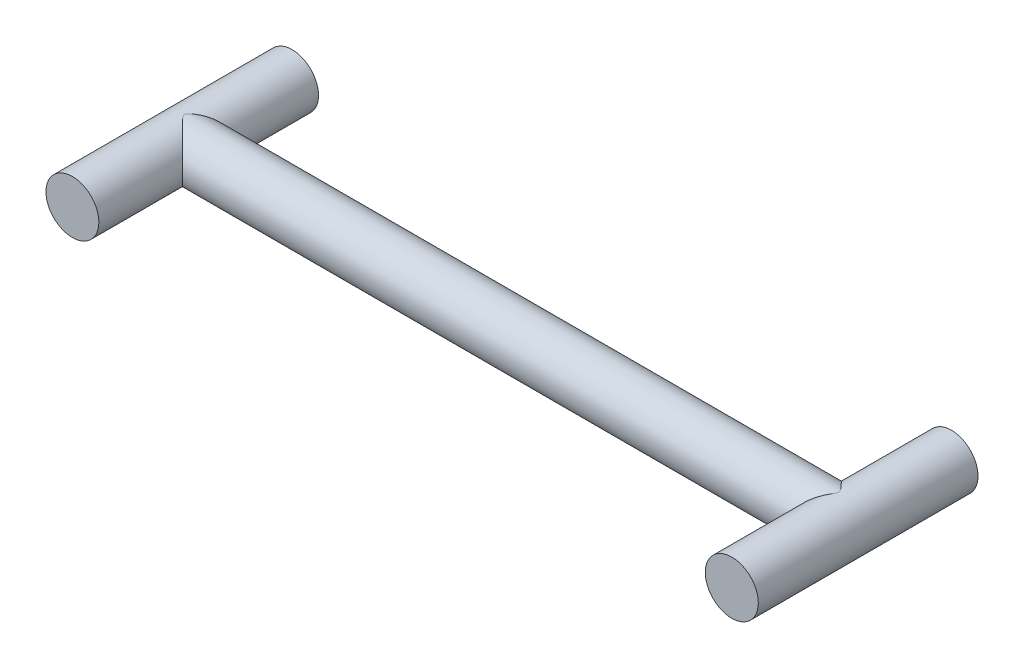
ISO-10303-21;
HEADER;
FILE_DESCRIPTION(('STEP AP214'),'2;1');
FILE_NAME('part.step','',(''),(''),'','','');
FILE_SCHEMA(('AUTOMOTIVE_DESIGN { 1 0 10303 214 1 1 1 1 }'));
ENDSEC;
DATA;
#1=APPLICATION_CONTEXT('core data for automotive mechanical design processes');
#2=APPLICATION_PROTOCOL_DEFINITION('international standard','automotive_design',2000,#1);
#3=PRODUCT_CONTEXT('',#1,'mechanical');
#4=PRODUCT('Part','Part','',(#3));
#5=PRODUCT_RELATED_PRODUCT_CATEGORY('part','',(#4));
#6=PRODUCT_DEFINITION_FORMATION('','',#4);
#7=PRODUCT_DEFINITION_CONTEXT('part definition',#1,'design');
#8=PRODUCT_DEFINITION('design','',#6,#7);
#9=PRODUCT_DEFINITION_SHAPE('','',#8);
#10=(LENGTH_UNIT() NAMED_UNIT(*) SI_UNIT(.MILLI.,.METRE.));
#11=(NAMED_UNIT(*) PLANE_ANGLE_UNIT() SI_UNIT($,.RADIAN.));
#12=(NAMED_UNIT(*) SI_UNIT($,.STERADIAN.) SOLID_ANGLE_UNIT());
#13=UNCERTAINTY_MEASURE_WITH_UNIT(LENGTH_MEASURE(1.E-05),#10,'distance_accuracy_value','');
#14=(GEOMETRIC_REPRESENTATION_CONTEXT(3) GLOBAL_UNCERTAINTY_ASSIGNED_CONTEXT((#13)) GLOBAL_UNIT_ASSIGNED_CONTEXT((#10,
#11,#12)) REPRESENTATION_CONTEXT('',''));
#15=CARTESIAN_POINT('',(0.,0.,0.));
#16=DIRECTION('',(0.,0.,1.));
#17=DIRECTION('',(1.,0.,0.));
#18=AXIS2_PLACEMENT_3D('',#15,#16,#17);
#19=CARTESIAN_POINT('',(15.,0.,0.));
#20=DIRECTION('',(-1.,0.,0.));
#21=DIRECTION('',(0.,0.,1.));
#22=AXIS2_PLACEMENT_3D('',#19,#20,#21);
#23=CYLINDRICAL_SURFACE('',#22,0.6);
#24=CARTESIAN_POINT('',(14.4044117802361,0.,0.6));
#25=CARTESIAN_POINT('',(14.4044138771677,-0.0267869529244519,0.599997901263103));
#26=CARTESIAN_POINT('',(14.4062120963939,-0.0536182281922061,0.598188349645153));
#27=CARTESIAN_POINT('',(14.4132577662871,-0.10638222517906,0.591097096718589));
#28=CARTESIAN_POINT('',(14.4185138946036,-0.132312513053645,0.585806660098265));
#29=CARTESIAN_POINT('',(14.4320164715084,-0.182318851200664,0.572211965447729));
#30=CARTESIAN_POINT('',(14.4402410852341,-0.206406923248302,0.563929713517909));
#31=CARTESIAN_POINT('',(14.4591712194591,-0.252491816672357,0.544858790481551));
#32=CARTESIAN_POINT('',(14.4698767871376,-0.274488598268544,0.534070071710793));
#33=CARTESIAN_POINT('',(14.4980714189654,-0.324761545706948,0.505639207119559));
#34=CARTESIAN_POINT('',(14.5165433177583,-0.351921728822773,0.486999533907745));
#35=CARTESIAN_POINT('',(14.5562908539631,-0.401702701016503,0.446836768729669));
#36=CARTESIAN_POINT('',(14.5775736304444,-0.424311548628157,0.425306332410302));
#37=CARTESIAN_POINT('',(14.6306249521029,-0.47303224307013,0.371507120734918));
#38=CARTESIAN_POINT('',(14.663274348087,-0.497137943723282,0.338296948356237));
#39=CARTESIAN_POINT('',(14.7305475350596,-0.537605300934136,0.269408911628499));
#40=CARTESIAN_POINT('',(14.7651703048471,-0.553970922858098,0.233732321626248));
#41=CARTESIAN_POINT('',(14.8224959018784,-0.575042168362166,0.173103948574968));
#42=CARTESIAN_POINT('',(14.8451286971234,-0.581824014591197,0.148769701342194));
#43=CARTESIAN_POINT('',(14.8822090470378,-0.590709384371346,0.106630215284313));
#44=CARTESIAN_POINT('',(14.8969291501786,-0.593616907265863,0.0892691757697787));
#45=CARTESIAN_POINT('',(14.9143419222993,-0.596484520137757,0.0650992338551544));
#46=CARTESIAN_POINT('',(14.9183048109041,-0.597091430397413,0.0593080244646573));
#47=CARTESIAN_POINT('',(14.9256996470576,-0.598157555059887,0.0473684138206939));
#48=CARTESIAN_POINT('',(14.9291318298737,-0.598616835006739,0.0412201725155951));
#49=CARTESIAN_POINT('',(14.9339336206098,-0.599227752667212,0.0307081333391748));
#50=CARTESIAN_POINT('',(14.9356024921829,-0.599430702090317,0.0264884939514652));
#51=CARTESIAN_POINT('',(14.938287530722,-0.599749909358583,0.0178495463590163));
#52=CARTESIAN_POINT('',(14.9393062153639,-0.599866501882923,0.0134310801385931));
#53=CARTESIAN_POINT('',(14.94048491511,-0.600000915423975,0.00440655178397685));
#54=CARTESIAN_POINT('',(14.9406325810968,-0.600017316056771,-0.000201279802066398));
#55=CARTESIAN_POINT('',(14.9399914220055,-0.599944665920674,-0.00935079168036245));
#56=CARTESIAN_POINT('',(14.9392013153037,-0.599855470837953,-0.0138923728353125));
#57=CARTESIAN_POINT('',(14.936518999167,-0.599541331228656,-0.0241784030979506));
#58=CARTESIAN_POINT('',(14.9343564974842,-0.599282274733914,-0.0298468805008357));
#59=CARTESIAN_POINT('',(14.929273501346,-0.598634072341127,-0.0408385289327078));
#60=CARTESIAN_POINT('',(14.9263485474109,-0.598244157076041,-0.0461594300570705));
#61=CARTESIAN_POINT('',(14.9168107719172,-0.596886793759699,-0.0619725350216555));
#62=CARTESIAN_POINT('',(14.9095443919428,-0.595742222857606,-0.0720431420990267));
#63=CARTESIAN_POINT('',(14.8944013426046,-0.593038541496862,-0.0916647917257681));
#64=CARTESIAN_POINT('',(14.8865228529075,-0.591478158214718,-0.10121412863171));
#65=CARTESIAN_POINT('',(14.8624511611103,-0.586180684539765,-0.129466736733267));
#66=CARTESIAN_POINT('',(14.8458626254335,-0.581832473887628,-0.147719996349821));
#67=CARTESIAN_POINT('',(14.7960121205245,-0.566365159802654,-0.201546771696467));
#68=CARTESIAN_POINT('',(14.7625825333598,-0.552813784279909,-0.236283476100139));
#69=CARTESIAN_POINT('',(14.6971983687312,-0.518857147482543,-0.303643789958164));
#70=CARTESIAN_POINT('',(14.6652407086645,-0.498467027120614,-0.336271879181443));
#71=CARTESIAN_POINT('',(14.6109456552456,-0.455706468244358,-0.391485904562562));
#72=CARTESIAN_POINT('',(14.5880631392271,-0.434817549528832,-0.414677987088154));
#73=CARTESIAN_POINT('',(14.544744243996,-0.388308254988935,-0.458513810137267));
#74=CARTESIAN_POINT('',(14.5243055001617,-0.362692514957153,-0.47916001469723));
#75=CARTESIAN_POINT('',(14.4911419274278,-0.312889489242033,-0.512629094905721));
#76=CARTESIAN_POINT('',(14.4777133090602,-0.289657612255417,-0.526169842708515));
#77=CARTESIAN_POINT('',(14.4536630892918,-0.240414485019034,-0.550409731077724));
#78=CARTESIAN_POINT('',(14.443037772208,-0.214406978688917,-0.561112633209323));
#79=CARTESIAN_POINT('',(14.4267227721825,-0.164387541185026,-0.577542431410931));
#80=CARTESIAN_POINT('',(14.420516700253,-0.140716785600117,-0.583790176615573));
#81=CARTESIAN_POINT('',(14.4109870070323,-0.0922291616927286,-0.593382787385633));
#82=CARTESIAN_POINT('',(14.4076617127123,-0.067412967423483,-0.596729337838035));
#83=CARTESIAN_POINT('',(14.4041337317549,-0.017257050603964,-0.600279848531962));
#84=CARTESIAN_POINT('',(14.4039403182727,0.00808400429247785,-0.600474476276708));
#85=CARTESIAN_POINT('',(14.4067154582712,0.0584133723828288,-0.597681648352057));
#86=CARTESIAN_POINT('',(14.4096844033,0.0834016415082788,-0.59469379864337));
#87=CARTESIAN_POINT('',(14.418363024875,0.131218896331405,-0.585958195219404));
#88=CARTESIAN_POINT('',(14.4239473162473,0.154094523307957,-0.580336700239064));
#89=CARTESIAN_POINT('',(14.4374636774123,0.198391374464734,-0.566726372438121));
#90=CARTESIAN_POINT('',(14.4453967461759,0.219811975024537,-0.558736532322553));
#91=CARTESIAN_POINT('',(14.4667488129209,0.269013447175633,-0.537222992353975));
#92=CARTESIAN_POINT('',(14.4810981434052,0.295980182349987,-0.522758889914831));
#93=CARTESIAN_POINT('',(14.5126641115048,0.34625862786026,-0.490912321141554));
#94=CARTESIAN_POINT('',(14.529886101484,0.369563354689944,-0.473524406636631));
#95=CARTESIAN_POINT('',(14.5732401862076,0.420570550154108,-0.429692476913695));
#96=CARTESIAN_POINT('',(14.6002963222035,0.446659988831081,-0.402293030158795));
#97=CARTESIAN_POINT('',(14.6568942370563,0.492427328377549,-0.344777937815131));
#98=CARTESIAN_POINT('',(14.6864419698361,0.512089290712479,-0.314655772924006));
#99=CARTESIAN_POINT('',(14.7322494376033,0.537349660685653,-0.26755535853646));
#100=CARTESIAN_POINT('',(14.7480351674344,0.545154185935995,-0.25125466643808));
#101=CARTESIAN_POINT('',(14.7798157745968,0.559214316250628,-0.218181390900313));
#102=CARTESIAN_POINT('',(14.7958107192509,0.565469409139167,-0.201408653457871));
#103=CARTESIAN_POINT('',(14.8277089367512,0.576443113019971,-0.167421666603654));
#104=CARTESIAN_POINT('',(14.8436123043754,0.581168330466909,-0.150209671464506));
#105=CARTESIAN_POINT('',(14.8749606050028,0.589142452086541,-0.115068807382047));
#106=CARTESIAN_POINT('',(14.8904055786703,0.592391487579687,-0.0971400023602496));
#107=CARTESIAN_POINT('',(14.9139571942064,0.596477516901344,-0.0660680188997264));
#108=CARTESIAN_POINT('',(14.92269363219,0.597761943582824,-0.0535476737081827));
#109=CARTESIAN_POINT('',(14.9317243397655,0.598951213871874,-0.0357098288250623));
#110=CARTESIAN_POINT('',(14.9337050674764,0.59919870207902,-0.0313249701051088));
#111=CARTESIAN_POINT('',(14.9370233343994,0.599601829971245,-0.0223153536433277));
#112=CARTESIAN_POINT('',(14.9383627333892,0.59975773553712,-0.0176913331866538));
#113=CARTESIAN_POINT('',(14.9399802508075,0.599943858572731,-0.00908154482206608));
#114=CARTESIAN_POINT('',(14.9404023528242,0.599991210261543,-0.00512450999501238));
#115=CARTESIAN_POINT('',(14.9405379666169,0.600006533480072,0.00279748416629695));
#116=CARTESIAN_POINT('',(14.9402523742541,0.599974605368956,0.00676242713959624));
#117=CARTESIAN_POINT('',(14.9388689649362,0.599816333466664,0.0156627842639453));
#118=CARTESIAN_POINT('',(14.9375692794466,0.599666427645186,0.0205650356613442));
#119=CARTESIAN_POINT('',(14.9342224804367,0.599262883679576,0.0301154077091647));
#120=CARTESIAN_POINT('',(14.9321711060703,0.599008653180526,0.0347619024384002));
#121=CARTESIAN_POINT('',(14.9226686062393,0.597762247978874,0.0537996276730146));
#122=CARTESIAN_POINT('',(14.9132712476894,0.59637755116749,0.0671267679449113));
#123=CARTESIAN_POINT('',(14.8934848541211,0.592902204734707,0.0929157378826827));
#124=CARTESIAN_POINT('',(14.8830883539619,0.590805887725876,0.105369620781714));
#125=CARTESIAN_POINT('',(14.8534098342165,0.583951950691666,0.139674718775823));
#126=CARTESIAN_POINT('',(14.8337032730487,0.578409640968841,0.161032422022244));
#127=CARTESIAN_POINT('',(14.7942851595771,0.565030812568009,0.203033393708289));
#128=CARTESIAN_POINT('',(14.7745736427206,0.557190924777519,0.22367556284165));
#129=CARTESIAN_POINT('',(14.7355639013175,0.539169696934768,0.264170099454596));
#130=CARTESIAN_POINT('',(14.7162643851033,0.528997420472808,0.284025184031598));
#131=CARTESIAN_POINT('',(14.6783198091199,0.50620413660324,0.322899636186412));
#132=CARTESIAN_POINT('',(14.6596741870673,0.49358529715401,0.341919725506705));
#133=CARTESIAN_POINT('',(14.6175553763427,0.461383383765697,0.384777220365034));
#134=CARTESIAN_POINT('',(14.5944112252886,0.44085862467691,0.408245216796597));
#135=CARTESIAN_POINT('',(14.5505074650161,0.395080066557858,0.452688294785397));
#136=CARTESIAN_POINT('',(14.5297451912015,0.36983163676571,0.473666162969041));
#137=CARTESIAN_POINT('',(14.495760579601,0.320416296031999,0.507970233044476));
#138=CARTESIAN_POINT('',(14.4818762137623,0.297179163000922,0.521972509731816));
#139=CARTESIAN_POINT('',(14.4569144470823,0.247808421480012,0.547133910524478));
#140=CARTESIAN_POINT('',(14.4458344850782,0.221677487384082,0.558295628862642));
#141=CARTESIAN_POINT('',(14.4288165610992,0.171616615353965,0.575434289601568));
#142=CARTESIAN_POINT('',(14.4223248469223,0.148066833402161,0.581969891424012));
#143=CARTESIAN_POINT('',(14.4122067901407,0.0997849739439403,0.592155101428775));
#144=CARTESIAN_POINT('',(14.4085731023323,0.0750561015631969,0.595812107697146));
#145=CARTESIAN_POINT('',(14.4058011475656,0.0417860583224632,0.598601786747473));
#146=CARTESIAN_POINT('',(14.4052809915848,0.0334478103214853,0.599125259347628));
#147=CARTESIAN_POINT('',(14.4045859482129,0.016741155159681,0.599824726167867));
#148=CARTESIAN_POINT('',(14.4044111248024,0.00837274269788234,0.600000655997868));
#149=CARTESIAN_POINT('',(14.4044117802361,0.,0.6));
#150=B_SPLINE_CURVE_WITH_KNOTS('',3,(#24,#25,#26,#27,#28,#29,#30,#31,#32,#33,#34,#35,#36,#37,
#38,#39,#40,#41,#42,#43,#44,#45,#46,#47,#48,#49,#50,#51,#52,#53,#54,#55,#56,#57,#58,#59,#60,#61,
#62,#63,#64,#65,#66,#67,#68,#69,#70,#71,#72,#73,#74,#75,#76,#77,#78,#79,#80,#81,#82,#83,#84,#85,
#86,#87,#88,#89,#90,#91,#92,#93,#94,#95,#96,#97,#98,#99,#100,#101,#102,#103,#104,#105,#106,#107,
#108,#109,#110,#111,#112,#113,#114,#115,#116,#117,#118,#119,#120,#121,#122,#123,#124,#125,#126,
#127,#128,#129,#130,#131,#132,#133,#134,#135,#136,#137,#138,#139,#140,#141,#142,#143,#144,#145,
#146,#147,#148,#149),.UNSPECIFIED.,.T.,.F.,(4,2,2,2,2,2,2,2,2,2,2,2,2,2,2,2,2,2,2,2,2,2,2,2,2,2,
2,2,2,2,2,2,2,2,2,2,2,2,2,2,2,2,2,2,2,2,2,2,2,2,2,2,2,2,2,2,2,2,2,2,2,2,4),(0.,
0.0803222801691046,0.160846902573798,0.240790905201445,0.32073642820843,0.433411090542751,
0.546377634240589,0.702865566285271,0.859273239978592,0.960929052819867,1.02959250489933,
1.05070930038946,1.07181670757834,1.08540811315146,1.09894656511956,1.11267650960222,
1.12642523998317,1.14453970349753,1.16276259083776,1.20007439281129,1.23750174692048,
1.31256090534336,1.46230109359445,1.61171192327367,1.72745581388977,1.84308678716593,
1.93293079395927,2.02265511032464,2.09809930955511,2.17349966468712,2.24912323130281,
2.32475616235899,2.39708530971781,2.46944526406473,2.57027947446217,2.67130370273844,
2.81009559080984,2.94922908240638,3.02117070215519,3.09313607107203,3.16478639369225,
3.23643034108489,3.28208883195398,3.29650924020001,3.31088757382578,3.3227671581742,
3.33463171199476,3.34976091423213,3.36497723549844,3.41368861519778,3.46279740942595,
3.55138310178425,3.64009934962428,3.72847652259249,3.81677573742018,3.93288421765554,
4.04886151439656,4.13996076345685,4.23097651213285,4.30653128266278,4.3818912350987,
4.40699275457477,4.43209892423355),.UNSPECIFIED.);
#151=CARTESIAN_POINT('',(14.4044117802361,0.,0.6));
#152=VERTEX_POINT('',#151);
#153=EDGE_CURVE('E43',#152,#152,#150,.T.);
#154=ORIENTED_EDGE('',*,*,#153,.F.);
#155=EDGE_LOOP('',(#154));
#156=FACE_BOUND('',#155,.T.);
#157=CARTESIAN_POINT('',(0.602112422880623,0.,0.6));
#158=CARTESIAN_POINT('',(0.602108227329578,0.0267500440066616,0.599995801496043));
#159=CARTESIAN_POINT('',(0.600311256231344,0.0535469409428353,0.598192550989909));
#160=CARTESIAN_POINT('',(0.593263794618739,0.106253257287472,0.591119822958435));
#161=CARTESIAN_POINT('',(0.58800312712855,0.132159824000218,0.585840131007082));
#162=CARTESIAN_POINT('',(0.574489305986293,0.182115308729485,0.572275225062206));
#163=CARTESIAN_POINT('',(0.566258515472655,0.206176521397741,0.564012471413674));
#164=CARTESIAN_POINT('',(0.547313487639444,0.252206367597728,0.544989389239753));
#165=CARTESIAN_POINT('',(0.536599467945087,0.274175184264933,0.534229279577511));
#166=CARTESIAN_POINT('',(0.508379903964304,0.324382381231514,0.50587869572989));
#167=CARTESIAN_POINT('',(0.48988957614286,0.351505911597435,0.487295262057261));
#168=CARTESIAN_POINT('',(0.45009183445887,0.401217441060633,0.447267509913797));
#169=CARTESIAN_POINT('',(0.428777339996823,0.423793668546067,0.425815999487354));
#170=CARTESIAN_POINT('',(0.375600620272691,0.472459841789907,0.372223439178674));
#171=CARTESIAN_POINT('',(0.342843253960256,0.496541117267249,0.339152921835045));
#172=CARTESIAN_POINT('',(0.275232798872467,0.536967215337399,0.27065075540754));
#173=CARTESIAN_POINT('',(0.240380137393653,0.553313609324468,0.235219587576029));
#174=CARTESIAN_POINT('',(0.18267644950492,0.574232862403717,0.175673572445258));
#175=CARTESIAN_POINT('',(0.160021527953717,0.580925701326345,0.152076499865581));
#176=CARTESIAN_POINT('',(0.121615219557304,0.589923921462632,0.110904586575421));
#177=CARTESIAN_POINT('',(0.105777789704037,0.592939640603437,0.0935809536249698));
#178=CARTESIAN_POINT('',(0.0846118330533912,0.59617149211164,0.0680768461630988));
#179=CARTESIAN_POINT('',(0.0785966129525836,0.596989557784856,0.0605330247764549));
#180=CARTESIAN_POINT('',(0.0672539795028314,0.598370262000744,0.0448941710198929));
#181=CARTESIAN_POINT('',(0.0619239364465005,0.598933899331076,0.0368014400509432));
#182=CARTESIAN_POINT('',(0.0560389504094133,0.599501611707589,0.0246857785190977));
#183=CARTESIAN_POINT('',(0.0545428898135645,0.599638143489124,0.0211520918677456));
#184=CARTESIAN_POINT('',(0.0521603346146688,0.599850040343388,0.0138921386421195));
#185=CARTESIAN_POINT('',(0.0512701360972898,0.599925777601551,0.0101671947478159));
#186=CARTESIAN_POINT('',(0.0504158552149373,0.599998151188623,0.00336607130743532));
#187=CARTESIAN_POINT('',(0.0503017429509467,0.600007613711775,0.000309751165196454));
#188=CARTESIAN_POINT('',(0.0506306005035572,0.599979946465349,-0.0057737664240182));
#189=CARTESIAN_POINT('',(0.051074178227446,0.599942765852743,-0.0088009284605804));
#190=CARTESIAN_POINT('',(0.0526951821475424,0.599802799091604,-0.0159387438926527));
#191=CARTESIAN_POINT('',(0.0540958886912182,0.599679652105722,-0.019995912491133));
#192=CARTESIAN_POINT('',(0.057476482095726,0.599365421383195,-0.0278675522433906));
#193=CARTESIAN_POINT('',(0.0594597618179489,0.599173938216623,-0.0316804376132276));
#194=CARTESIAN_POINT('',(0.0698805223775652,0.598098633470963,-0.0499312898843602));
#195=CARTESIAN_POINT('',(0.0803495237323133,0.596817924248983,-0.0631013363146917));
#196=CARTESIAN_POINT('',(0.101926134263795,0.593532109654066,-0.0887759485145063));
#197=CARTESIAN_POINT('',(0.113037564487641,0.591522190813133,-0.101275443511773));
#198=CARTESIAN_POINT('',(0.144654437224152,0.584841686453032,-0.135950263848981));
#199=CARTESIAN_POINT('',(0.165456768245635,0.579336202343829,-0.157735008965138));
#200=CARTESIAN_POINT('',(0.206896281516864,0.565875876559825,-0.200719009628152));
#201=CARTESIAN_POINT('',(0.227533194244347,0.557917643390199,-0.221917409911108));
#202=CARTESIAN_POINT('',(0.268303540648265,0.539489951780209,-0.26356850125467));
#203=CARTESIAN_POINT('',(0.288438406477397,0.52902883501653,-0.284023414732575));
#204=CARTESIAN_POINT('',(0.327963975563786,0.505478576660837,-0.324083829751853));
#205=CARTESIAN_POINT('',(0.347355331699839,0.492391806677367,-0.343690078554664));
#206=CARTESIAN_POINT('',(0.389848808760947,0.459828212038607,-0.386592806192124));
#207=CARTESIAN_POINT('',(0.41266862706551,0.439571747834331,-0.409588459986496));
#208=CARTESIAN_POINT('',(0.455966639328331,0.394472770994423,-0.453180191380991));
#209=CARTESIAN_POINT('',(0.476447414302621,0.369635393903154,-0.473778914356537));
#210=CARTESIAN_POINT('',(0.510299653278758,0.320677061779706,-0.507807780950982));
#211=CARTESIAN_POINT('',(0.524274193277958,0.297402505631997,-0.521848131299452));
#212=CARTESIAN_POINT('',(0.549389243296314,0.247945375060254,-0.547074548683671));
#213=CARTESIAN_POINT('',(0.560533365585699,0.221766569101077,-0.558264253860696));
#214=CARTESIAN_POINT('',(0.577643906042204,0.171595997770796,-0.575442076635085));
#215=CARTESIAN_POINT('',(0.584168328226544,0.147988324317374,-0.581990940243529));
#216=CARTESIAN_POINT('',(0.594339212668552,0.0995545142178583,-0.592199225278018));
#217=CARTESIAN_POINT('',(0.597987490552033,0.0747291567920793,-0.595860469574349));
#218=CARTESIAN_POINT('',(0.602145038674078,0.0244645760484018,-0.600032756663416));
#219=CARTESIAN_POINT('',(0.602643793697298,-0.000976419255995374,-0.600533246743506));
#220=CARTESIAN_POINT('',(0.600433815673248,-0.0515758882835879,-0.598315473913532));
#221=CARTESIAN_POINT('',(0.597724786468547,-0.0767343357041658,-0.595596913805912));
#222=CARTESIAN_POINT('',(0.589522484090572,-0.124767240423469,-0.587364878937563));
#223=CARTESIAN_POINT('',(0.58417592059287,-0.147692944692656,-0.581998673971855));
#224=CARTESIAN_POINT('',(0.571106735790941,-0.192129749845854,-0.568879485082752));
#225=CARTESIAN_POINT('',(0.56338319514279,-0.213640299476246,-0.561125577666537));
#226=CARTESIAN_POINT('',(0.542613544779295,-0.26280581998554,-0.540269620363195));
#227=CARTESIAN_POINT('',(0.52866006418094,-0.289690927646793,-0.52625486699902));
#228=CARTESIAN_POINT('',(0.497872149050501,-0.339903472328394,-0.495317894785455));
#229=CARTESIAN_POINT('',(0.481031964936628,-0.363223630037174,-0.478389873171925));
#230=CARTESIAN_POINT('',(0.43858160938638,-0.41432207169764,-0.43568436570884));
#231=CARTESIAN_POINT('',(0.412040278976454,-0.440528679655912,-0.408958307538707));
#232=CARTESIAN_POINT('',(0.356417702312491,-0.486633556271724,-0.352862014594743));
#233=CARTESIAN_POINT('',(0.327332431983435,-0.506521591174688,-0.323487588212505));
#234=CARTESIAN_POINT('',(0.267485589878367,-0.540545328541847,-0.262729828116804));
#235=CARTESIAN_POINT('',(0.236713387959795,-0.554638253533854,-0.231333466561113));
#236=CARTESIAN_POINT('',(0.174483146018886,-0.577207572411399,-0.167320480084719));
#237=CARTESIAN_POINT('',(0.143026614663313,-0.585695238474591,-0.134706444399331));
#238=CARTESIAN_POINT('',(0.100165235087289,-0.593858435011616,-0.0867945540386125));
#239=CARTESIAN_POINT('',(0.0878734974091078,-0.595779020327163,-0.0726251409359725));
#240=CARTESIAN_POINT('',(0.0697180687466384,-0.598099807721741,-0.0485730860307886));
#241=CARTESIAN_POINT('',(0.0632548251268848,-0.598800841929801,-0.0392531426158337));
#242=CARTESIAN_POINT('',(0.0566407741917186,-0.599444851869909,-0.025991752334436));
#243=CARTESIAN_POINT('',(0.0552010268844568,-0.59957796659672,-0.0227460476641237));
#244=CARTESIAN_POINT('',(0.0528040701320004,-0.599793693372831,-0.0160820503470792));
#245=CARTESIAN_POINT('',(0.0518452606963015,-0.599876473075106,-0.0126643721496096));
#246=CARTESIAN_POINT('',(0.0507009933091643,-0.599974242658186,-0.00627239193553922));
#247=CARTESIAN_POINT('',(0.0504145656982324,-0.59999811726407,-0.00331719211922436));
#248=CARTESIAN_POINT('',(0.0503723611463149,-0.600001665071813,0.00259441916520922));
#249=CARTESIAN_POINT('',(0.0506160933703172,-0.599981379158553,0.00555082698113141));
#250=CARTESIAN_POINT('',(0.0517229691507965,-0.599887027002677,0.0122415219090921));
#251=CARTESIAN_POINT('',(0.0527477792493932,-0.599798847670081,0.0159476948634466));
#252=CARTESIAN_POINT('',(0.0553596111671935,-0.599563597451243,0.0231640121826025));
#253=CARTESIAN_POINT('',(0.0569499009438027,-0.599416183585405,0.0266728768124632));
#254=CARTESIAN_POINT('',(0.064522813070139,-0.598672229269641,0.0415250225408291));
#255=CARTESIAN_POINT('',(0.0720788755717088,-0.597831661567812,0.0519966317334025));
#256=CARTESIAN_POINT('',(0.0879383371561445,-0.595714336059223,0.0722929942844643));
#257=CARTESIAN_POINT('',(0.0962470203277733,-0.594434284448762,0.0821121746598094));
#258=CARTESIAN_POINT('',(0.12151221091354,-0.589966585012182,0.110994594430246));
#259=CARTESIAN_POINT('',(0.138904269998718,-0.586143589015832,0.129608609093614));
#260=CARTESIAN_POINT('',(0.173747177903657,-0.576786575107744,0.166353253606744));
#261=CARTESIAN_POINT('',(0.191198073927198,-0.571250317703855,0.184483216835245));
#262=CARTESIAN_POINT('',(0.225897129283203,-0.558435071422118,0.220252400871276));
#263=CARTESIAN_POINT('',(0.243145641193554,-0.551159818602756,0.237892584454191));
#264=CARTESIAN_POINT('',(0.277267325377129,-0.534808791906333,0.272668065881024));
#265=CARTESIAN_POINT('',(0.294140659718825,-0.525733812963183,0.28980358281055));
#266=CARTESIAN_POINT('',(0.344346556188169,-0.495484152037326,0.340686523664052));
#267=CARTESIAN_POINT('',(0.376908536076255,-0.471410801327204,0.373546238754245));
#268=CARTESIAN_POINT('',(0.438279675482519,-0.414944494776364,0.435387844059929));
#269=CARTESIAN_POINT('',(0.467100956052689,-0.382579474764138,0.464382267777232));
#270=CARTESIAN_POINT('',(0.507647090428428,-0.324802076624085,0.505142100204525));
#271=CARTESIAN_POINT('',(0.521427252733611,-0.302294149668625,0.51898788387237));
#272=CARTESIAN_POINT('',(0.546359959011056,-0.254471466170301,0.544032365189735));
#273=CARTESIAN_POINT('',(0.557512701239935,-0.229156921617834,0.555231262564935));
#274=CARTESIAN_POINT('',(0.576584699388705,-0.175788343315191,0.574379039765319));
#275=CARTESIAN_POINT('',(0.584465348386555,-0.14770618613042,0.582289116722952));
#276=CARTESIAN_POINT('',(0.596081720153081,-0.0899199005307161,0.59394806248366));
#277=CARTESIAN_POINT('',(0.599833604771179,-0.0602225774833646,0.597713156646044));
#278=CARTESIAN_POINT('',(0.601858452753953,-0.020255320185183,0.599745131842092));
#279=CARTESIAN_POINT('',(0.602114011857924,-0.0101310202848211,0.600001590095655));
#280=CARTESIAN_POINT('',(0.602112422880623,0.,0.6));
#281=B_SPLINE_CURVE_WITH_KNOTS('',3,(#157,#158,#159,#160,#161,#162,#163,#164,#165,#166,#167,
#168,#169,#170,#171,#172,#173,#174,#175,#176,#177,#178,#179,#180,#181,#182,#183,#184,#185,#186,
#187,#188,#189,#190,#191,#192,#193,#194,#195,#196,#197,#198,#199,#200,#201,#202,#203,#204,#205,
#206,#207,#208,#209,#210,#211,#212,#213,#214,#215,#216,#217,#218,#219,#220,#221,#222,#223,#224,
#225,#226,#227,#228,#229,#230,#231,#232,#233,#234,#235,#236,#237,#238,#239,#240,#241,#242,#243,
#244,#245,#246,#247,#248,#249,#250,#251,#252,#253,#254,#255,#256,#257,#258,#259,#260,#261,#262,
#263,#264,#265,#266,#267,#268,#269,#270,#271,#272,#273,#274,#275,#276,#277,#278,#279,#280),
.UNSPECIFIED.,.T.,.F.,(4,2,2,2,2,2,2,2,2,2,2,2,2,2,2,2,2,2,2,2,2,2,2,2,2,2,2,2,2,2,2,2,2,2,2,2,
2,2,2,2,2,2,2,2,2,2,2,2,2,2,2,2,2,2,2,2,2,2,2,2,2,4),(0.,0.0802160954372972,0.160668938599059,
0.240528247546693,0.320380560429549,0.432920675364611,0.545748481168865,0.702137531926234,
0.858494797519364,0.95856597282269,1.02944581666035,1.05850178561358,1.08744267836352,
1.098928430638,1.11034331882231,1.11946691743908,1.12860046981866,1.14140467396848,
1.15428497952791,1.20453418526175,1.25512130445185,1.34681318141642,1.43863241685408,
1.53014979606245,1.62158488180019,1.73584867208992,1.84998513431851,1.94134155130404,
2.03258078369774,2.10831857334177,2.18400851356337,2.25995102444423,2.33590054723457,
2.40803457689757,2.48019654099032,2.57977028847853,2.67954471633329,2.81645814731101,
2.95359221019226,3.09172112379144,3.22957140730964,3.28614187320732,3.32000172407528,
3.33063617299262,3.34123500446169,3.35009728651681,3.35895136714581,3.37042021299995,
3.38195644531749,3.42047545555319,3.45928969505419,3.53644254702725,3.61369667851959,
3.69078630581714,3.76784195838026,3.92351143597331,4.07866318413096,4.16777446940191,
4.25687902846846,4.34700693365331,4.43678076850031,4.4671609387102),.UNSPECIFIED.);
#282=CARTESIAN_POINT('',(0.602112422880623,0.,0.6));
#283=VERTEX_POINT('',#282);
#284=EDGE_CURVE('E10',#283,#283,#281,.T.);
#285=ORIENTED_EDGE('',*,*,#284,.F.);
#286=EDGE_LOOP('',(#285));
#287=FACE_BOUND('',#286,.T.);
#288=ADVANCED_FACE('F33',(#156,#287),#23,.T.);
#289=CARTESIAN_POINT('',(15.0082240302076,0.,2.5));
#290=DIRECTION('',(0.,0.,-1.));
#291=DIRECTION('',(-1.,0.,0.));
#292=AXIS2_PLACEMENT_3D('',#289,#290,#291);
#293=CYLINDRICAL_SURFACE('',#292,0.603812249971577);
#294=CARTESIAN_POINT('',(15.0082240302076,0.,-2.5));
#295=DIRECTION('',(0.,0.,1.));
#296=DIRECTION('',(1.,0.,0.));
#297=AXIS2_PLACEMENT_3D('',#294,#295,#296);
#298=CIRCLE('',#297,0.603812249971577);
#299=CARTESIAN_POINT('',(15.6120362801792,0.,-2.5));
#300=VERTEX_POINT('',#299);
#301=EDGE_CURVE('E51',#300,#300,#298,.T.);
#302=ORIENTED_EDGE('',*,*,#301,.T.);
#303=EDGE_LOOP('',(#302));
#304=FACE_BOUND('',#303,.T.);
#305=CARTESIAN_POINT('',(15.0082240302076,0.,2.5));
#306=DIRECTION('',(0.,0.,1.));
#307=DIRECTION('',(1.,0.,0.));
#308=AXIS2_PLACEMENT_3D('',#305,#306,#307);
#309=CIRCLE('',#308,0.603812249971577);
#310=CARTESIAN_POINT('',(15.6120362801792,0.,2.5));
#311=VERTEX_POINT('',#310);
#312=EDGE_CURVE('E47',#311,#311,#309,.T.);
#313=ORIENTED_EDGE('',*,*,#312,.F.);
#314=EDGE_LOOP('',(#313));
#315=FACE_BOUND('',#314,.T.);
#316=ORIENTED_EDGE('',*,*,#153,.T.);
#317=EDGE_LOOP('',(#316));
#318=FACE_BOUND('',#317,.T.);
#319=ADVANCED_FACE('F56',(#304,#315,#318),#293,.T.);
#320=CARTESIAN_POINT('',(15.0082240302076,0.,2.5));
#321=DIRECTION('',(0.,0.,1.));
#322=DIRECTION('',(1.,0.,0.));
#323=AXIS2_PLACEMENT_3D('',#320,#321,#322);
#324=PLANE('',#323);
#325=ORIENTED_EDGE('',*,*,#312,.T.);
#326=EDGE_LOOP('',(#325));
#327=FACE_BOUND('',#326,.T.);
#328=ADVANCED_FACE('F60',(#327),#324,.T.);
#329=CARTESIAN_POINT('',(15.0082240302076,0.,-2.5));
#330=DIRECTION('',(0.,0.,1.));
#331=DIRECTION('',(1.,0.,0.));
#332=AXIS2_PLACEMENT_3D('',#329,#330,#331);
#333=PLANE('',#332);
#334=ORIENTED_EDGE('',*,*,#301,.F.);
#335=EDGE_LOOP('',(#334));
#336=FACE_BOUND('',#335,.T.);
#337=ADVANCED_FACE('F62',(#336),#333,.F.);
#338=CARTESIAN_POINT('',(0.,0.,2.5));
#339=DIRECTION('',(0.,0.,-1.));
#340=DIRECTION('',(-1.,0.,0.));
#341=AXIS2_PLACEMENT_3D('',#338,#339,#340);
#342=CYLINDRICAL_SURFACE('',#341,0.602112422880623);
#343=CARTESIAN_POINT('',(0.,0.,-2.5));
#344=DIRECTION('',(0.,0.,1.));
#345=DIRECTION('',(1.,0.,0.));
#346=AXIS2_PLACEMENT_3D('',#343,#344,#345);
#347=CIRCLE('',#346,0.602112422880623);
#348=CARTESIAN_POINT('',(0.602112422880623,0.,-2.5));
#349=VERTEX_POINT('',#348);
#350=EDGE_CURVE('E129',#349,#349,#347,.T.);
#351=ORIENTED_EDGE('',*,*,#350,.T.);
#352=EDGE_LOOP('',(#351));
#353=FACE_BOUND('',#352,.T.);
#354=CARTESIAN_POINT('',(0.,0.,2.5));
#355=DIRECTION('',(0.,0.,1.));
#356=DIRECTION('',(1.,0.,0.));
#357=AXIS2_PLACEMENT_3D('',#354,#355,#356);
#358=CIRCLE('',#357,0.602112422880623);
#359=CARTESIAN_POINT('',(0.602112422880623,0.,2.5));
#360=VERTEX_POINT('',#359);
#361=EDGE_CURVE('E127',#360,#360,#358,.T.);
#362=ORIENTED_EDGE('',*,*,#361,.F.);
#363=EDGE_LOOP('',(#362));
#364=FACE_BOUND('',#363,.T.);
#365=ORIENTED_EDGE('',*,*,#284,.T.);
#366=EDGE_LOOP('',(#365));
#367=FACE_BOUND('',#366,.T.);
#368=ADVANCED_FACE('F65',(#353,#364,#367),#342,.T.);
#369=CARTESIAN_POINT('',(0.,0.,2.5));
#370=DIRECTION('',(0.,0.,1.));
#371=DIRECTION('',(1.,0.,0.));
#372=AXIS2_PLACEMENT_3D('',#369,#370,#371);
#373=PLANE('',#372);
#374=ORIENTED_EDGE('',*,*,#361,.T.);
#375=EDGE_LOOP('',(#374));
#376=FACE_BOUND('',#375,.T.);
#377=ADVANCED_FACE('F72',(#376),#373,.T.);
#378=CARTESIAN_POINT('',(0.,0.,-2.5));
#379=DIRECTION('',(0.,0.,1.));
#380=DIRECTION('',(1.,0.,0.));
#381=AXIS2_PLACEMENT_3D('',#378,#379,#380);
#382=PLANE('',#381);
#383=ORIENTED_EDGE('',*,*,#350,.F.);
#384=EDGE_LOOP('',(#383));
#385=FACE_BOUND('',#384,.T.);
#386=ADVANCED_FACE('F74',(#385),#382,.F.);
#387=CLOSED_SHELL('',(#288,#319,#328,#337,#368,#377,#386));
#388=MANIFOLD_SOLID_BREP('B2',#387);
#389=ADVANCED_BREP_SHAPE_REPRESENTATION('',(#18,#388),#14);
#390=SHAPE_DEFINITION_REPRESENTATION(#9,#389);
ENDSEC;
END-ISO-10303-21;
